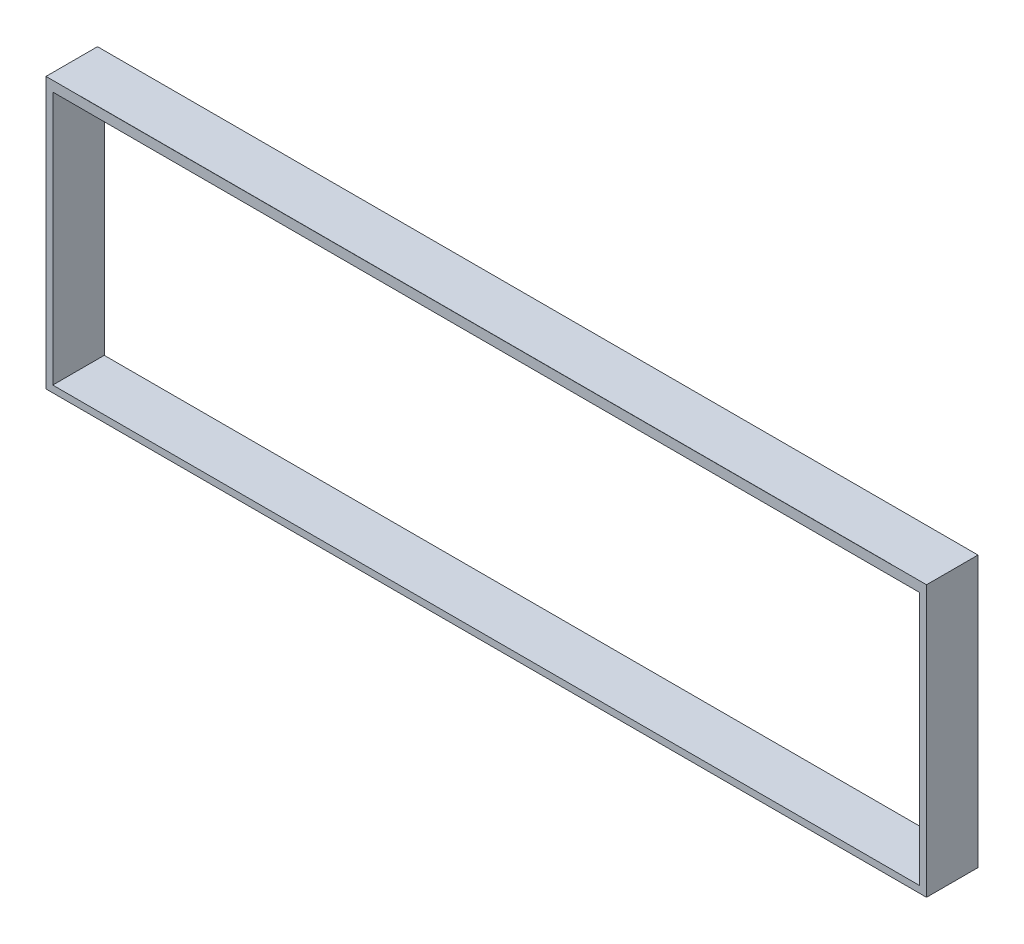
ISO-10303-21;
HEADER;
FILE_DESCRIPTION(('STEP AP214'),'2;1');
FILE_NAME('part.step','',(''),(''),'','','');
FILE_SCHEMA(('AUTOMOTIVE_DESIGN { 1 0 10303 214 1 1 1 1 }'));
ENDSEC;
DATA;
#1=APPLICATION_CONTEXT('core data for automotive mechanical design processes');
#2=APPLICATION_PROTOCOL_DEFINITION('international standard','automotive_design',2000,#1);
#3=PRODUCT_CONTEXT('',#1,'mechanical');
#4=PRODUCT('Part','Part','',(#3));
#5=PRODUCT_RELATED_PRODUCT_CATEGORY('part','',(#4));
#6=PRODUCT_DEFINITION_FORMATION('','',#4);
#7=PRODUCT_DEFINITION_CONTEXT('part definition',#1,'design');
#8=PRODUCT_DEFINITION('design','',#6,#7);
#9=PRODUCT_DEFINITION_SHAPE('','',#8);
#10=(LENGTH_UNIT() NAMED_UNIT(*) SI_UNIT(.MILLI.,.METRE.));
#11=(NAMED_UNIT(*) PLANE_ANGLE_UNIT() SI_UNIT($,.RADIAN.));
#12=(NAMED_UNIT(*) SI_UNIT($,.STERADIAN.) SOLID_ANGLE_UNIT());
#13=UNCERTAINTY_MEASURE_WITH_UNIT(LENGTH_MEASURE(1.E-05),#10,'distance_accuracy_value','');
#14=(GEOMETRIC_REPRESENTATION_CONTEXT(3) GLOBAL_UNCERTAINTY_ASSIGNED_CONTEXT((#13)) GLOBAL_UNIT_ASSIGNED_CONTEXT((#10,
#11,#12)) REPRESENTATION_CONTEXT('',''));
#15=CARTESIAN_POINT('',(0.,0.,0.));
#16=DIRECTION('',(0.,0.,1.));
#17=DIRECTION('',(1.,0.,0.));
#18=AXIS2_PLACEMENT_3D('',#15,#16,#17);
#19=CARTESIAN_POINT('',(385.158930485448,79.9999999999998,325.971961984462));
#20=DIRECTION('',(0.,-1.,0.));
#21=DIRECTION('',(0.,0.,-1.));
#22=AXIS2_PLACEMENT_3D('',#19,#20,#21);
#23=PLANE('',#22);
#24=DIRECTION('',(-1.,0.,0.));
#25=VECTOR('',#24,1.);
#26=CARTESIAN_POINT('',(385.158930485448,80.,130.));
#27=LINE('',#26,#25);
#28=CARTESIAN_POINT('',(130.100001279295,80.,130.));
#29=VERTEX_POINT('',#28);
#30=CARTESIAN_POINT('',(120.000001279295,80.,130.));
#31=VERTEX_POINT('',#30);
#32=EDGE_CURVE('E176',#29,#31,#27,.T.);
#33=ORIENTED_EDGE('',*,*,#32,.F.);
#34=DIRECTION('',(0.,0.,1.));
#35=VECTOR('',#34,1.);
#36=CARTESIAN_POINT('',(130.100001279295,79.9999999999998,325.971961984462));
#37=LINE('',#36,#35);
#38=CARTESIAN_POINT('',(130.100001279295,80.,114.7839));
#39=VERTEX_POINT('',#38);
#40=EDGE_CURVE('E258',#39,#29,#37,.T.);
#41=ORIENTED_EDGE('',*,*,#40,.F.);
#42=DIRECTION('',(1.,0.,0.));
#43=VECTOR('',#42,1.);
#44=CARTESIAN_POINT('',(385.158930485448,80.,114.7839));
#45=LINE('',#44,#43);
#46=CARTESIAN_POINT('',(-130.100001279295,80.,114.7839));
#47=VERTEX_POINT('',#46);
#48=EDGE_CURVE('E184',#47,#39,#45,.T.);
#49=ORIENTED_EDGE('',*,*,#48,.F.);
#50=DIRECTION('',(0.,0.,-1.));
#51=VECTOR('',#50,1.);
#52=CARTESIAN_POINT('',(-130.100001279295,79.9999999999998,325.971961984462));
#53=LINE('',#52,#51);
#54=CARTESIAN_POINT('',(-130.100001279295,80.,130.));
#55=VERTEX_POINT('',#54);
#56=EDGE_CURVE('E173',#55,#47,#53,.T.);
#57=ORIENTED_EDGE('',*,*,#56,.F.);
#58=CARTESIAN_POINT('',(-120.000001279295,80.,130.));
#59=VERTEX_POINT('',#58);
#60=EDGE_CURVE('E160',#59,#55,#27,.T.);
#61=ORIENTED_EDGE('',*,*,#60,.F.);
#62=DIRECTION('',(0.,0.,-1.));
#63=VECTOR('',#62,1.);
#64=CARTESIAN_POINT('',(-120.000001279295,80.,150.971961984462));
#65=LINE('',#64,#63);
#66=CARTESIAN_POINT('',(-120.000001279295,80.,129.971961984462));
#67=VERTEX_POINT('',#66);
#68=EDGE_CURVE('E170',#59,#67,#65,.T.);
#69=ORIENTED_EDGE('',*,*,#68,.T.);
#70=DIRECTION('',(1.,0.,0.));
#71=VECTOR('',#70,1.);
#72=CARTESIAN_POINT('',(-141.358775635325,80.,129.971961984462));
#73=LINE('',#72,#71);
#74=CARTESIAN_POINT('',(120.000001279295,80.,129.971961984462));
#75=VERTEX_POINT('',#74);
#76=EDGE_CURVE('E192',#67,#75,#73,.T.);
#77=ORIENTED_EDGE('',*,*,#76,.T.);
#78=DIRECTION('',(0.,0.,-1.));
#79=VECTOR('',#78,1.);
#80=CARTESIAN_POINT('',(120.000001279295,80.,150.971961984461));
#81=LINE('',#80,#79);
#82=EDGE_CURVE('E181',#75,#31,#81,.F.);
#83=ORIENTED_EDGE('',*,*,#82,.T.);
#84=EDGE_LOOP('',(#33,#41,#49,#57,#61,#69,#77,#83));
#85=FACE_BOUND('',#84,.T.);
#86=ADVANCED_FACE('F43',(#85),#23,.F.);
#87=CARTESIAN_POINT('',(385.158930485448,0.,83.7839));
#88=DIRECTION('',(0.,1.,0.));
#89=DIRECTION('',(0.,0.,1.));
#90=AXIS2_PLACEMENT_3D('',#87,#88,#89);
#91=PLANE('',#90);
#92=DIRECTION('',(-1.,0.,0.));
#93=VECTOR('',#92,1.);
#94=CARTESIAN_POINT('',(141.380515451974,0.,129.783940449292));
#95=LINE('',#94,#93);
#96=CARTESIAN_POINT('',(119.100001279295,0.,129.783940449292));
#97=VERTEX_POINT('',#96);
#98=CARTESIAN_POINT('',(-119.100001279295,0.,129.783940449292));
#99=VERTEX_POINT('',#98);
#100=EDGE_CURVE('E240',#97,#99,#95,.T.);
#101=ORIENTED_EDGE('',*,*,#100,.F.);
#102=DIRECTION('',(0.,0.,1.));
#103=VECTOR('',#102,1.);
#104=CARTESIAN_POINT('',(119.100001279295,0.,129.783940449292));
#105=LINE('',#104,#103);
#106=CARTESIAN_POINT('',(119.100001279295,0.,118.783940449292));
#107=VERTEX_POINT('',#106);
#108=EDGE_CURVE('E194',#107,#97,#105,.T.);
#109=ORIENTED_EDGE('',*,*,#108,.F.);
#110=DIRECTION('',(-1.,0.,0.));
#111=VECTOR('',#110,1.);
#112=CARTESIAN_POINT('',(141.380515451974,0.,118.783940449292));
#113=LINE('',#112,#111);
#114=CARTESIAN_POINT('',(-119.100001279295,0.,118.783940449292));
#115=VERTEX_POINT('',#114);
#116=EDGE_CURVE('E220',#107,#115,#113,.T.);
#117=ORIENTED_EDGE('',*,*,#116,.T.);
#118=DIRECTION('',(0.,0.,-1.));
#119=VECTOR('',#118,1.);
#120=CARTESIAN_POINT('',(-119.100001279295,0.,129.783940449292));
#121=LINE('',#120,#119);
#122=EDGE_CURVE('E234',#99,#115,#121,.T.);
#123=ORIENTED_EDGE('',*,*,#122,.F.);
#124=EDGE_LOOP('',(#101,#109,#117,#123));
#125=FACE_BOUND('',#124,.T.);
#126=DIRECTION('',(1.,0.,0.));
#127=VECTOR('',#126,1.);
#128=CARTESIAN_POINT('',(385.158930485448,0.,130.));
#129=LINE('',#128,#127);
#130=CARTESIAN_POINT('',(-130.100001279295,0.,130.));
#131=VERTEX_POINT('',#130);
#132=CARTESIAN_POINT('',(130.100001279295,0.,130.));
#133=VERTEX_POINT('',#132);
#134=EDGE_CURVE('E302',#131,#133,#129,.T.);
#135=ORIENTED_EDGE('',*,*,#134,.F.);
#136=DIRECTION('',(0.,0.,1.));
#137=VECTOR('',#136,1.);
#138=CARTESIAN_POINT('',(-130.100001279295,0.,83.7839));
#139=LINE('',#138,#137);
#140=CARTESIAN_POINT('',(-130.100001279295,0.,114.7839));
#141=VERTEX_POINT('',#140);
#142=EDGE_CURVE('E247',#141,#131,#139,.T.);
#143=ORIENTED_EDGE('',*,*,#142,.F.);
#144=DIRECTION('',(-1.,0.,0.));
#145=VECTOR('',#144,1.);
#146=CARTESIAN_POINT('',(385.158930485448,0.,114.7839));
#147=LINE('',#146,#145);
#148=CARTESIAN_POINT('',(130.100001279295,0.,114.7839));
#149=VERTEX_POINT('',#148);
#150=EDGE_CURVE('E290',#149,#141,#147,.T.);
#151=ORIENTED_EDGE('',*,*,#150,.F.);
#152=DIRECTION('',(0.,0.,-1.));
#153=VECTOR('',#152,1.);
#154=CARTESIAN_POINT('',(130.100001279295,0.,83.7839));
#155=LINE('',#154,#153);
#156=EDGE_CURVE('E257',#133,#149,#155,.T.);
#157=ORIENTED_EDGE('',*,*,#156,.F.);
#158=EDGE_LOOP('',(#135,#143,#151,#157));
#159=FACE_BOUND('',#158,.T.);
#160=ADVANCED_FACE('F329',(#125,#159),#91,.F.);
#161=CARTESIAN_POINT('',(130.100001279295,8.,328.432884795909));
#162=DIRECTION('',(1.,0.,0.));
#163=DIRECTION('',(0.,0.,-1.));
#164=AXIS2_PLACEMENT_3D('',#161,#162,#163);
#165=PLANE('',#164);
#166=ORIENTED_EDGE('',*,*,#40,.T.);
#167=DIRECTION('',(0.,-1.,0.));
#168=VECTOR('',#167,1.);
#169=CARTESIAN_POINT('',(130.100001279295,8.,130.));
#170=LINE('',#169,#168);
#171=EDGE_CURVE('E301',#29,#133,#170,.T.);
#172=ORIENTED_EDGE('',*,*,#171,.T.);
#173=ORIENTED_EDGE('',*,*,#156,.T.);
#174=DIRECTION('',(0.,1.,0.));
#175=VECTOR('',#174,1.);
#176=CARTESIAN_POINT('',(130.100001279295,8.00000000000009,114.7839));
#177=LINE('',#176,#175);
#178=EDGE_CURVE('E179',#149,#39,#177,.T.);
#179=ORIENTED_EDGE('',*,*,#178,.T.);
#180=EDGE_LOOP('',(#166,#172,#173,#179));
#181=FACE_BOUND('',#180,.T.);
#182=ADVANCED_FACE('F45',(#181),#165,.T.);
#183=CARTESIAN_POINT('',(-130.100001279295,8.,328.432884795909));
#184=DIRECTION('',(1.,0.,0.));
#185=DIRECTION('',(0.,0.,-1.));
#186=AXIS2_PLACEMENT_3D('',#183,#184,#185);
#187=PLANE('',#186);
#188=DIRECTION('',(0.,-1.,0.));
#189=VECTOR('',#188,1.);
#190=CARTESIAN_POINT('',(-130.100001279295,8.,130.));
#191=LINE('',#190,#189);
#192=EDGE_CURVE('E305',#55,#131,#191,.T.);
#193=ORIENTED_EDGE('',*,*,#192,.F.);
#194=ORIENTED_EDGE('',*,*,#56,.T.);
#195=DIRECTION('',(0.,1.,0.));
#196=VECTOR('',#195,1.);
#197=CARTESIAN_POINT('',(-130.100001279295,8.00000000000009,114.7839));
#198=LINE('',#197,#196);
#199=EDGE_CURVE('E287',#141,#47,#198,.T.);
#200=ORIENTED_EDGE('',*,*,#199,.F.);
#201=ORIENTED_EDGE('',*,*,#142,.T.);
#202=EDGE_LOOP('',(#193,#194,#200,#201));
#203=FACE_BOUND('',#202,.T.);
#204=ADVANCED_FACE('F337',(#203),#187,.F.);
#205=CARTESIAN_POINT('',(385.158930485448,76.9999999999998,325.971961984462));
#206=DIRECTION('',(0.,-1.,0.));
#207=DIRECTION('',(0.,0.,-1.));
#208=AXIS2_PLACEMENT_3D('',#205,#206,#207);
#209=PLANE('',#208);
#210=DIRECTION('',(0.,0.,1.));
#211=VECTOR('',#210,1.);
#212=CARTESIAN_POINT('',(128.100001279295,76.9999999999998,325.971961984462));
#213=LINE('',#212,#211);
#214=CARTESIAN_POINT('',(128.100001279295,77.,114.7839));
#215=VERTEX_POINT('',#214);
#216=CARTESIAN_POINT('',(128.100001279295,77.,130.));
#217=VERTEX_POINT('',#216);
#218=EDGE_CURVE('E244',#215,#217,#213,.T.);
#219=ORIENTED_EDGE('',*,*,#218,.T.);
#220=DIRECTION('',(-1.,0.,0.));
#221=VECTOR('',#220,1.);
#222=CARTESIAN_POINT('',(385.158930485448,77.,130.));
#223=LINE('',#222,#221);
#224=CARTESIAN_POINT('',(-128.100001279295,77.,130.));
#225=VERTEX_POINT('',#224);
#226=EDGE_CURVE('E282',#217,#225,#223,.T.);
#227=ORIENTED_EDGE('',*,*,#226,.T.);
#228=DIRECTION('',(0.,0.,-1.));
#229=VECTOR('',#228,1.);
#230=CARTESIAN_POINT('',(-128.100001279295,76.9999999999998,328.432884795909));
#231=LINE('',#230,#229);
#232=CARTESIAN_POINT('',(-128.100001279295,77.,114.7839));
#233=VERTEX_POINT('',#232);
#234=EDGE_CURVE('E249',#225,#233,#231,.T.);
#235=ORIENTED_EDGE('',*,*,#234,.T.);
#236=DIRECTION('',(1.,0.,0.));
#237=VECTOR('',#236,1.);
#238=CARTESIAN_POINT('',(385.158930485448,77.,114.7839));
#239=LINE('',#238,#237);
#240=EDGE_CURVE('E274',#233,#215,#239,.T.);
#241=ORIENTED_EDGE('',*,*,#240,.T.);
#242=EDGE_LOOP('',(#219,#227,#235,#241));
#243=FACE_BOUND('',#242,.T.);
#244=ADVANCED_FACE('F314',(#243),#209,.T.);
#245=CARTESIAN_POINT('',(385.158930485448,2.00000000000001,83.7839));
#246=DIRECTION('',(0.,1.,0.));
#247=DIRECTION('',(0.,0.,1.));
#248=AXIS2_PLACEMENT_3D('',#245,#246,#247);
#249=PLANE('',#248);
#250=DIRECTION('',(0.,0.,1.));
#251=VECTOR('',#250,1.);
#252=CARTESIAN_POINT('',(-128.100001279295,1.99999999999995,328.432884795909));
#253=LINE('',#252,#251);
#254=CARTESIAN_POINT('',(-128.100001279295,1.99999999999996,114.7839));
#255=VERTEX_POINT('',#254);
#256=CARTESIAN_POINT('',(-128.100001279295,1.99999999999999,130.));
#257=VERTEX_POINT('',#256);
#258=EDGE_CURVE('E243',#255,#257,#253,.T.);
#259=ORIENTED_EDGE('',*,*,#258,.T.);
#260=DIRECTION('',(1.,0.,0.));
#261=VECTOR('',#260,1.);
#262=CARTESIAN_POINT('',(385.158930485448,1.99999999999999,130.));
#263=LINE('',#262,#261);
#264=CARTESIAN_POINT('',(128.100001279295,1.99999999999999,130.));
#265=VERTEX_POINT('',#264);
#266=EDGE_CURVE('E58',#257,#265,#263,.T.);
#267=ORIENTED_EDGE('',*,*,#266,.T.);
#268=DIRECTION('',(0.,0.,-1.));
#269=VECTOR('',#268,1.);
#270=CARTESIAN_POINT('',(128.100001279295,2.00000000000001,83.7839));
#271=LINE('',#270,#269);
#272=CARTESIAN_POINT('',(128.100001279295,2.,114.7839));
#273=VERTEX_POINT('',#272);
#274=EDGE_CURVE('E248',#265,#273,#271,.T.);
#275=ORIENTED_EDGE('',*,*,#274,.T.);
#276=DIRECTION('',(-1.,0.,0.));
#277=VECTOR('',#276,1.);
#278=CARTESIAN_POINT('',(385.158930485448,2.,114.7839));
#279=LINE('',#278,#277);
#280=EDGE_CURVE('E271',#273,#255,#279,.T.);
#281=ORIENTED_EDGE('',*,*,#280,.T.);
#282=EDGE_LOOP('',(#259,#267,#275,#281));
#283=FACE_BOUND('',#282,.T.);
#284=ADVANCED_FACE('F276',(#283),#249,.T.);
#285=CARTESIAN_POINT('',(128.100001279295,8.,328.432884795909));
#286=DIRECTION('',(1.,0.,0.));
#287=DIRECTION('',(0.,0.,-1.));
#288=AXIS2_PLACEMENT_3D('',#285,#286,#287);
#289=PLANE('',#288);
#290=DIRECTION('',(0.,-1.,0.));
#291=VECTOR('',#290,1.);
#292=CARTESIAN_POINT('',(128.100001279295,8.,130.));
#293=LINE('',#292,#291);
#294=EDGE_CURVE('E278',#217,#265,#293,.T.);
#295=ORIENTED_EDGE('',*,*,#294,.F.);
#296=ORIENTED_EDGE('',*,*,#218,.F.);
#297=DIRECTION('',(0.,1.,0.));
#298=VECTOR('',#297,1.);
#299=CARTESIAN_POINT('',(128.100001279295,8.00000000000009,114.7839));
#300=LINE('',#299,#298);
#301=EDGE_CURVE('E280',#273,#215,#300,.T.);
#302=ORIENTED_EDGE('',*,*,#301,.F.);
#303=ORIENTED_EDGE('',*,*,#274,.F.);
#304=EDGE_LOOP('',(#295,#296,#302,#303));
#305=FACE_BOUND('',#304,.T.);
#306=ADVANCED_FACE('F318',(#305),#289,.F.);
#307=CARTESIAN_POINT('',(-128.100001279295,8.,328.432884795909));
#308=DIRECTION('',(1.,0.,0.));
#309=DIRECTION('',(0.,0.,-1.));
#310=AXIS2_PLACEMENT_3D('',#307,#308,#309);
#311=PLANE('',#310);
#312=ORIENTED_EDGE('',*,*,#234,.F.);
#313=DIRECTION('',(0.,-1.,0.));
#314=VECTOR('',#313,1.);
#315=CARTESIAN_POINT('',(-128.100001279295,8.,130.));
#316=LINE('',#315,#314);
#317=EDGE_CURVE('E303',#225,#257,#316,.T.);
#318=ORIENTED_EDGE('',*,*,#317,.T.);
#319=ORIENTED_EDGE('',*,*,#258,.F.);
#320=DIRECTION('',(0.,1.,0.));
#321=VECTOR('',#320,1.);
#322=CARTESIAN_POINT('',(-128.100001279295,8.00000000000009,114.7839));
#323=LINE('',#322,#321);
#324=EDGE_CURVE('E51',#255,#233,#323,.T.);
#325=ORIENTED_EDGE('',*,*,#324,.T.);
#326=EDGE_LOOP('',(#312,#318,#319,#325));
#327=FACE_BOUND('',#326,.T.);
#328=ADVANCED_FACE('F265',(#327),#311,.T.);
#329=CARTESIAN_POINT('',(-141.358775635325,80.,129.971961984462));
#330=DIRECTION('',(0.,-0.70710678118655,-0.707106781186545));
#331=DIRECTION('',(0.,0.707106781186545,-0.70710678118655));
#332=AXIS2_PLACEMENT_3D('',#329,#330,#331);
#333=PLANE('',#332);
#334=DIRECTION('',(-1.,0.,0.));
#335=VECTOR('',#334,1.);
#336=CARTESIAN_POINT('',(-141.358775635325,79.9719619844616,130.));
#337=LINE('',#336,#335);
#338=CARTESIAN_POINT('',(119.971963263757,79.9719619844616,130.));
#339=VERTEX_POINT('',#338);
#340=CARTESIAN_POINT('',(-119.971963263757,79.9719619844616,130.));
#341=VERTEX_POINT('',#340);
#342=EDGE_CURVE('E65',#339,#341,#337,.T.);
#343=ORIENTED_EDGE('',*,*,#342,.F.);
#344=DIRECTION('',(-0.577350269189627,-0.577350269189624,0.577350269189627));
#345=VECTOR('',#344,1.);
#346=CARTESIAN_POINT('',(117.600001279295,77.6,132.371961984462));
#347=LINE('',#346,#345);
#348=EDGE_CURVE('E190',#339,#75,#347,.F.);
#349=ORIENTED_EDGE('',*,*,#348,.T.);
#350=ORIENTED_EDGE('',*,*,#76,.F.);
#351=DIRECTION('',(0.577350269189627,-0.577350269189624,0.577350269189627));
#352=VECTOR('',#351,1.);
#353=CARTESIAN_POINT('',(-117.600001279295,77.6,132.371961984462));
#354=LINE('',#353,#352);
#355=EDGE_CURVE('E178',#67,#341,#354,.T.);
#356=ORIENTED_EDGE('',*,*,#355,.T.);
#357=EDGE_LOOP('',(#343,#349,#350,#356));
#358=FACE_BOUND('',#357,.T.);
#359=ADVANCED_FACE('F325',(#358),#333,.F.);
#360=CARTESIAN_POINT('',(117.600001279295,77.6,132.371961984462));
#361=DIRECTION('',(-0.707106781186545,0.707106781186549,0.));
#362=DIRECTION('',(0.,0.,1.));
#363=AXIS2_PLACEMENT_3D('',#360,#361,#362);
#364=PLANE('',#363);
#365=DIRECTION('',(0.70710678118655,0.707106781186546,0.));
#366=VECTOR('',#365,1.);
#367=CARTESIAN_POINT('',(117.600001279295,77.6,130.));
#368=LINE('',#367,#366);
#369=EDGE_CURVE('E174',#31,#339,#368,.F.);
#370=ORIENTED_EDGE('',*,*,#369,.F.);
#371=ORIENTED_EDGE('',*,*,#82,.F.);
#372=ORIENTED_EDGE('',*,*,#348,.F.);
#373=EDGE_LOOP('',(#370,#371,#372));
#374=FACE_BOUND('',#373,.T.);
#375=ADVANCED_FACE('F378',(#374),#364,.T.);
#376=CARTESIAN_POINT('',(-117.600001279295,77.6,132.371961984462));
#377=DIRECTION('',(-0.707106781186545,-0.707106781186549,0.));
#378=DIRECTION('',(0.,0.,1.));
#379=AXIS2_PLACEMENT_3D('',#376,#377,#378);
#380=PLANE('',#379);
#381=DIRECTION('',(-0.70710678118655,0.707106781186546,0.));
#382=VECTOR('',#381,1.);
#383=CARTESIAN_POINT('',(-117.600001279295,77.6,130.));
#384=LINE('',#383,#382);
#385=EDGE_CURVE('E12',#341,#59,#384,.T.);
#386=ORIENTED_EDGE('',*,*,#385,.F.);
#387=ORIENTED_EDGE('',*,*,#355,.F.);
#388=ORIENTED_EDGE('',*,*,#68,.F.);
#389=EDGE_LOOP('',(#386,#387,#388));
#390=FACE_BOUND('',#389,.T.);
#391=ADVANCED_FACE('F177',(#390),#380,.F.);
#392=CARTESIAN_POINT('',(141.380515451974,-2.49999999999996,120.227316122266));
#393=DIRECTION('',(0.,1.,0.));
#394=DIRECTION('',(0.,0.,1.));
#395=AXIS2_PLACEMENT_3D('',#392,#393,#394);
#396=PLANE('',#395);
#397=DIRECTION('',(-1.,0.,0.));
#398=VECTOR('',#397,1.);
#399=CARTESIAN_POINT('',(141.380515451974,-2.49999999999996,122.915246900655));
#400=LINE('',#399,#398);
#401=CARTESIAN_POINT('',(116.700001279295,-2.49999999999996,122.915246900655));
#402=VERTEX_POINT('',#401);
#403=CARTESIAN_POINT('',(-116.700001279295,-2.49999999999996,122.915246900655));
#404=VERTEX_POINT('',#403);
#405=EDGE_CURVE('E237',#402,#404,#400,.T.);
#406=ORIENTED_EDGE('',*,*,#405,.T.);
#407=DIRECTION('',(0.,0.,-1.));
#408=VECTOR('',#407,1.);
#409=CARTESIAN_POINT('',(-116.700001279295,-2.49999999999996,120.227316122266));
#410=LINE('',#409,#408);
#411=CARTESIAN_POINT('',(-116.700001279295,-2.49999999999996,120.227316122266));
#412=VERTEX_POINT('',#411);
#413=EDGE_CURVE('E223',#404,#412,#410,.T.);
#414=ORIENTED_EDGE('',*,*,#413,.T.);
#415=DIRECTION('',(-1.,0.,0.));
#416=VECTOR('',#415,1.);
#417=CARTESIAN_POINT('',(141.380515451974,-2.49999999999996,120.227316122266));
#418=LINE('',#417,#416);
#419=CARTESIAN_POINT('',(116.700001279295,-2.49999999999996,120.227316122266));
#420=VERTEX_POINT('',#419);
#421=EDGE_CURVE('E213',#420,#412,#418,.T.);
#422=ORIENTED_EDGE('',*,*,#421,.F.);
#423=DIRECTION('',(0.,0.,1.));
#424=VECTOR('',#423,1.);
#425=CARTESIAN_POINT('',(116.700001279295,-2.49999999999996,122.915246900655));
#426=LINE('',#425,#424);
#427=EDGE_CURVE('E198',#420,#402,#426,.T.);
#428=ORIENTED_EDGE('',*,*,#427,.T.);
#429=EDGE_LOOP('',(#406,#414,#422,#428));
#430=FACE_BOUND('',#429,.T.);
#431=ADVANCED_FACE('F377',(#430),#396,.F.);
#432=CARTESIAN_POINT('',(141.380515451974,-2.49999999999996,122.915246900655));
#433=DIRECTION('',(0.,0.939692620785913,-0.342020143325655));
#434=DIRECTION('',(0.,0.342020143325655,0.939692620785913));
#435=AXIS2_PLACEMENT_3D('',#432,#433,#434);
#436=PLANE('',#435);
#437=DIRECTION('',(0.,0.342020143325655,0.939692620785913));
#438=VECTOR('',#437,1.);
#439=CARTESIAN_POINT('',(-119.100001279295,-2.49999999999996,122.915246900655));
#440=LINE('',#439,#438);
#441=CARTESIAN_POINT('',(-119.100001279295,-0.0999999999999458,129.509192707346));
#442=VERTEX_POINT('',#441);
#443=EDGE_CURVE('E232',#442,#99,#440,.T.);
#444=ORIENTED_EDGE('',*,*,#443,.F.);
#445=DIRECTION('',(-0.323615577118175,0.323615577118173,0.889126490715996));
#446=VECTOR('',#445,1.);
#447=CARTESIAN_POINT('',(-136.0544205715,16.854419292205,176.091076872647));
#448=LINE('',#447,#446);
#449=EDGE_CURVE('E226',#442,#404,#448,.F.);
#450=ORIENTED_EDGE('',*,*,#449,.T.);
#451=ORIENTED_EDGE('',*,*,#405,.F.);
#452=DIRECTION('',(0.323615577118174,0.323615577118173,0.889126490715997));
#453=VECTOR('',#452,1.);
#454=CARTESIAN_POINT('',(136.0544205715,16.854419292205,176.091076872647));
#455=LINE('',#454,#453);
#456=CARTESIAN_POINT('',(119.100001279295,-0.0999999999999458,129.509192707346));
#457=VERTEX_POINT('',#456);
#458=EDGE_CURVE('E196',#402,#457,#455,.T.);
#459=ORIENTED_EDGE('',*,*,#458,.T.);
#460=DIRECTION('',(0.,-0.342020143325655,-0.939692620785913));
#461=VECTOR('',#460,1.);
#462=CARTESIAN_POINT('',(119.100001279295,-2.49999999999996,122.915246900655));
#463=LINE('',#462,#461);
#464=EDGE_CURVE('E207',#97,#457,#463,.T.);
#465=ORIENTED_EDGE('',*,*,#464,.F.);
#466=ORIENTED_EDGE('',*,*,#100,.T.);
#467=EDGE_LOOP('',(#444,#450,#451,#459,#465,#466));
#468=FACE_BOUND('',#467,.T.);
#469=ADVANCED_FACE('F480',(#468),#436,.F.);
#470=CARTESIAN_POINT('',(-119.100001279295,8.00000000000004,188.432884795909));
#471=DIRECTION('',(1.,0.,0.));
#472=DIRECTION('',(0.,0.,-1.));
#473=AXIS2_PLACEMENT_3D('',#470,#471,#472);
#474=PLANE('',#473);
#475=DIRECTION('',(0.,-0.866025403784435,0.500000000000007));
#476=VECTOR('',#475,1.);
#477=CARTESIAN_POINT('',(-119.100001279295,0.,118.783940449292));
#478=LINE('',#477,#476);
#479=CARTESIAN_POINT('',(-119.100001279295,-0.099999999999951,118.841675476211));
#480=VERTEX_POINT('',#479);
#481=EDGE_CURVE('E217',#115,#480,#478,.T.);
#482=ORIENTED_EDGE('',*,*,#481,.T.);
#483=DIRECTION('',(0.,0.,1.));
#484=VECTOR('',#483,1.);
#485=CARTESIAN_POINT('',(-119.100001279295,-0.0999999999999671,188.432884795909));
#486=LINE('',#485,#484);
#487=EDGE_CURVE('E229',#480,#442,#486,.T.);
#488=ORIENTED_EDGE('',*,*,#487,.T.);
#489=ORIENTED_EDGE('',*,*,#443,.T.);
#490=ORIENTED_EDGE('',*,*,#122,.T.);
#491=EDGE_LOOP('',(#482,#488,#489,#490));
#492=FACE_BOUND('',#491,.T.);
#493=ADVANCED_FACE('F470',(#492),#474,.F.);
#494=CARTESIAN_POINT('',(-119.100001279295,-0.0999999999999671,188.432884795909));
#495=DIRECTION('',(0.707106781186546,0.70710678118655,0.));
#496=DIRECTION('',(0.,0.,1.));
#497=AXIS2_PLACEMENT_3D('',#494,#495,#496);
#498=PLANE('',#497);
#499=DIRECTION('',(0.654653670707978,-0.654653670707974,0.377964473009232));
#500=VECTOR('',#499,1.);
#501=CARTESIAN_POINT('',(-101.880642664741,-17.3193586145542,128.783276807596));
#502=LINE('',#501,#500);
#503=EDGE_CURVE('E215',#412,#480,#502,.F.);
#504=ORIENTED_EDGE('',*,*,#503,.F.);
#505=ORIENTED_EDGE('',*,*,#413,.F.);
#506=ORIENTED_EDGE('',*,*,#449,.F.);
#507=ORIENTED_EDGE('',*,*,#487,.F.);
#508=EDGE_LOOP('',(#504,#505,#506,#507));
#509=FACE_BOUND('',#508,.T.);
#510=ADVANCED_FACE('F460',(#509),#498,.F.);
#511=CARTESIAN_POINT('',(141.380515451974,0.,118.783940449292));
#512=DIRECTION('',(0.,0.500000000000007,0.866025403784435));
#513=DIRECTION('',(0.,-0.866025403784435,0.500000000000007));
#514=AXIS2_PLACEMENT_3D('',#511,#512,#513);
#515=PLANE('',#514);
#516=ORIENTED_EDGE('',*,*,#421,.T.);
#517=ORIENTED_EDGE('',*,*,#503,.T.);
#518=ORIENTED_EDGE('',*,*,#481,.F.);
#519=ORIENTED_EDGE('',*,*,#116,.F.);
#520=DIRECTION('',(0.,0.866025403784435,-0.500000000000007));
#521=VECTOR('',#520,1.);
#522=CARTESIAN_POINT('',(119.100001279295,0.,118.783940449292));
#523=LINE('',#522,#521);
#524=CARTESIAN_POINT('',(119.100001279295,-0.099999999999951,118.841675476211));
#525=VERTEX_POINT('',#524);
#526=EDGE_CURVE('E210',#525,#107,#523,.T.);
#527=ORIENTED_EDGE('',*,*,#526,.F.);
#528=DIRECTION('',(-0.654653670707975,-0.654653670707976,0.377964473009233));
#529=VECTOR('',#528,1.);
#530=CARTESIAN_POINT('',(101.880642664741,-17.3193586145543,128.783276807596));
#531=LINE('',#530,#529);
#532=EDGE_CURVE('E201',#525,#420,#531,.T.);
#533=ORIENTED_EDGE('',*,*,#532,.T.);
#534=EDGE_LOOP('',(#516,#517,#518,#519,#527,#533));
#535=FACE_BOUND('',#534,.T.);
#536=ADVANCED_FACE('F450',(#535),#515,.F.);
#537=CARTESIAN_POINT('',(119.100001279295,8.00000000000004,188.432884795909));
#538=DIRECTION('',(1.,0.,0.));
#539=DIRECTION('',(0.,0.,-1.));
#540=AXIS2_PLACEMENT_3D('',#537,#538,#539);
#541=PLANE('',#540);
#542=ORIENTED_EDGE('',*,*,#464,.T.);
#543=DIRECTION('',(0.,0.,-1.));
#544=VECTOR('',#543,1.);
#545=CARTESIAN_POINT('',(119.100001279295,-0.099999999999945,120.227316122266));
#546=LINE('',#545,#544);
#547=EDGE_CURVE('E204',#457,#525,#546,.T.);
#548=ORIENTED_EDGE('',*,*,#547,.T.);
#549=ORIENTED_EDGE('',*,*,#526,.T.);
#550=ORIENTED_EDGE('',*,*,#108,.T.);
#551=EDGE_LOOP('',(#542,#548,#549,#550));
#552=FACE_BOUND('',#551,.T.);
#553=ADVANCED_FACE('F440',(#552),#541,.T.);
#554=CARTESIAN_POINT('',(119.100001279295,-0.0999999999999671,188.432884795909));
#555=DIRECTION('',(0.707106781186547,-0.707106781186547,0.));
#556=DIRECTION('',(0.,0.,1.));
#557=AXIS2_PLACEMENT_3D('',#554,#555,#556);
#558=PLANE('',#557);
#559=ORIENTED_EDGE('',*,*,#458,.F.);
#560=ORIENTED_EDGE('',*,*,#427,.F.);
#561=ORIENTED_EDGE('',*,*,#532,.F.);
#562=ORIENTED_EDGE('',*,*,#547,.F.);
#563=EDGE_LOOP('',(#559,#560,#561,#562));
#564=FACE_BOUND('',#563,.T.);
#565=ADVANCED_FACE('F431',(#564),#558,.T.);
#566=CARTESIAN_POINT('',(0.,0.,114.7839));
#567=DIRECTION('',(0.,0.,-1.));
#568=DIRECTION('',(0.,1.,0.));
#569=AXIS2_PLACEMENT_3D('',#566,#567,#568);
#570=PLANE('',#569);
#571=ORIENTED_EDGE('',*,*,#150,.T.);
#572=ORIENTED_EDGE('',*,*,#199,.T.);
#573=ORIENTED_EDGE('',*,*,#48,.T.);
#574=ORIENTED_EDGE('',*,*,#178,.F.);
#575=EDGE_LOOP('',(#571,#572,#573,#574));
#576=FACE_BOUND('',#575,.T.);
#577=ORIENTED_EDGE('',*,*,#301,.T.);
#578=ORIENTED_EDGE('',*,*,#240,.F.);
#579=ORIENTED_EDGE('',*,*,#324,.F.);
#580=ORIENTED_EDGE('',*,*,#280,.F.);
#581=EDGE_LOOP('',(#577,#578,#579,#580));
#582=FACE_BOUND('',#581,.T.);
#583=ADVANCED_FACE('F270',(#576,#582),#570,.T.);
#584=CARTESIAN_POINT('',(0.,0.,130.));
#585=DIRECTION('',(0.,0.,1.));
#586=DIRECTION('',(1.,0.,0.));
#587=AXIS2_PLACEMENT_3D('',#584,#585,#586);
#588=PLANE('',#587);
#589=ORIENTED_EDGE('',*,*,#32,.T.);
#590=ORIENTED_EDGE('',*,*,#369,.T.);
#591=ORIENTED_EDGE('',*,*,#342,.T.);
#592=ORIENTED_EDGE('',*,*,#385,.T.);
#593=ORIENTED_EDGE('',*,*,#60,.T.);
#594=ORIENTED_EDGE('',*,*,#192,.T.);
#595=ORIENTED_EDGE('',*,*,#134,.T.);
#596=ORIENTED_EDGE('',*,*,#171,.F.);
#597=EDGE_LOOP('',(#589,#590,#591,#592,#593,#594,#595,#596));
#598=FACE_BOUND('',#597,.T.);
#599=ORIENTED_EDGE('',*,*,#294,.T.);
#600=ORIENTED_EDGE('',*,*,#266,.F.);
#601=ORIENTED_EDGE('',*,*,#317,.F.);
#602=ORIENTED_EDGE('',*,*,#226,.F.);
#603=EDGE_LOOP('',(#599,#600,#601,#602));
#604=FACE_BOUND('',#603,.T.);
#605=ADVANCED_FACE('F159',(#598,#604),#588,.T.);
#606=CLOSED_SHELL('',(#86,#160,#182,#204,#244,#284,#306,#328,#359,#375,#391,#431,#469,#493,#510,
#536,#553,#565,#583,#605));
#607=MANIFOLD_SOLID_BREP('B2',#606);
#608=ADVANCED_BREP_SHAPE_REPRESENTATION('',(#18,#607),#14);
#609=SHAPE_DEFINITION_REPRESENTATION(#9,#608);
ENDSEC;
END-ISO-10303-21;
